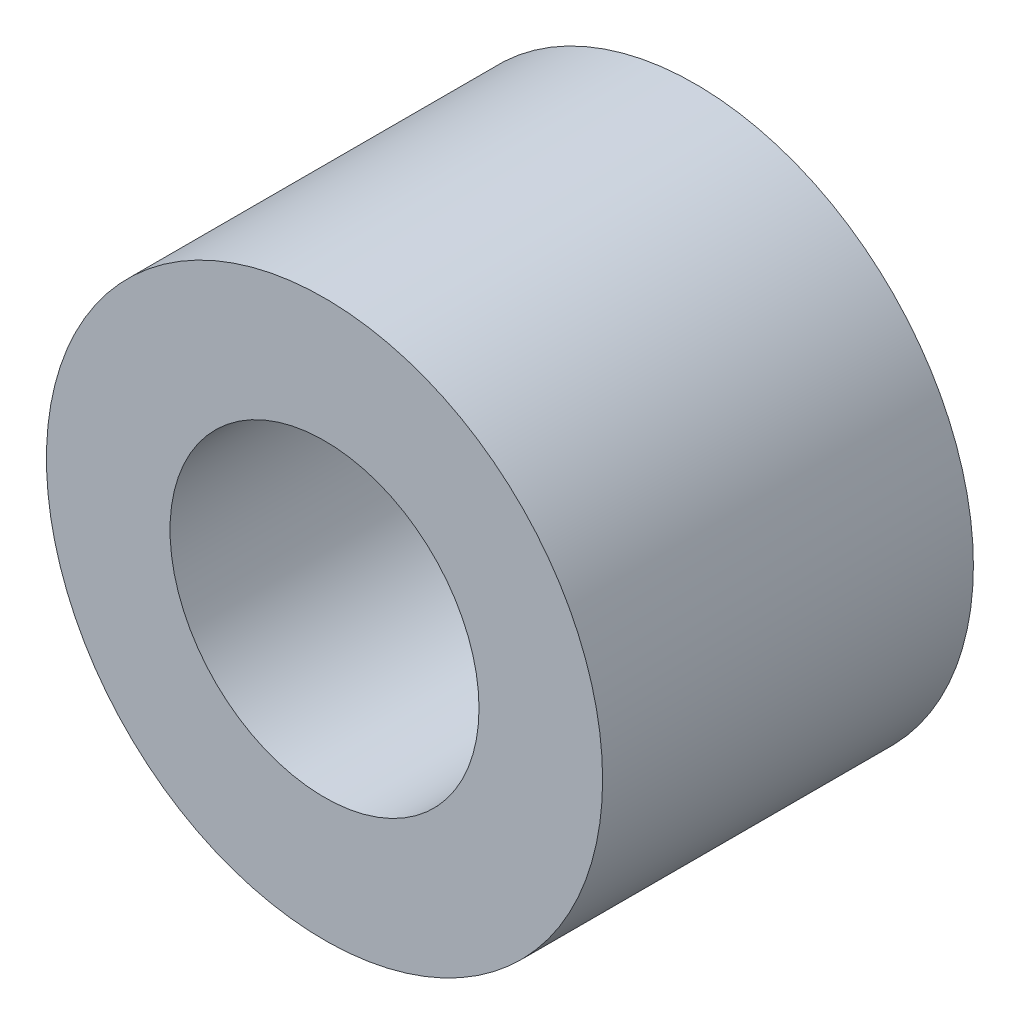
ISO-10303-21;
HEADER;
FILE_DESCRIPTION(('STEP AP214'),'2;1');
FILE_NAME('part.step','',(''),(''),'','','');
FILE_SCHEMA(('AUTOMOTIVE_DESIGN { 1 0 10303 214 1 1 1 1 }'));
ENDSEC;
DATA;
#1=APPLICATION_CONTEXT('core data for automotive mechanical design processes');
#2=APPLICATION_PROTOCOL_DEFINITION('international standard','automotive_design',2000,#1);
#3=PRODUCT_CONTEXT('',#1,'mechanical');
#4=PRODUCT('Part','Part','',(#3));
#5=PRODUCT_RELATED_PRODUCT_CATEGORY('part','',(#4));
#6=PRODUCT_DEFINITION_FORMATION('','',#4);
#7=PRODUCT_DEFINITION_CONTEXT('part definition',#1,'design');
#8=PRODUCT_DEFINITION('design','',#6,#7);
#9=PRODUCT_DEFINITION_SHAPE('','',#8);
#10=(LENGTH_UNIT() NAMED_UNIT(*) SI_UNIT(.MILLI.,.METRE.));
#11=(NAMED_UNIT(*) PLANE_ANGLE_UNIT() SI_UNIT($,.RADIAN.));
#12=(NAMED_UNIT(*) SI_UNIT($,.STERADIAN.) SOLID_ANGLE_UNIT());
#13=UNCERTAINTY_MEASURE_WITH_UNIT(LENGTH_MEASURE(1.E-05),#10,'distance_accuracy_value','');
#14=(GEOMETRIC_REPRESENTATION_CONTEXT(3) GLOBAL_UNCERTAINTY_ASSIGNED_CONTEXT((#13)) GLOBAL_UNIT_ASSIGNED_CONTEXT((#10,
#11,#12)) REPRESENTATION_CONTEXT('',''));
#15=CARTESIAN_POINT('',(0.,0.,0.));
#16=DIRECTION('',(0.,0.,1.));
#17=DIRECTION('',(1.,0.,0.));
#18=AXIS2_PLACEMENT_3D('',#15,#16,#17);
#19=CARTESIAN_POINT('',(0.,0.,6.));
#20=DIRECTION('',(0.,0.,1.));
#21=DIRECTION('',(1.,0.,0.));
#22=AXIS2_PLACEMENT_3D('',#19,#20,#21);
#23=PLANE('',#22);
#24=CARTESIAN_POINT('',(0.,0.,6.));
#25=DIRECTION('',(0.,0.,1.));
#26=DIRECTION('',(1.,0.,0.));
#27=AXIS2_PLACEMENT_3D('',#24,#25,#26);
#28=CIRCLE('',#27,4.5);
#29=CARTESIAN_POINT('',(4.5,0.,6.));
#30=VERTEX_POINT('',#29);
#31=EDGE_CURVE('E10',#30,#30,#28,.T.);
#32=ORIENTED_EDGE('',*,*,#31,.T.);
#33=EDGE_LOOP('',(#32));
#34=FACE_BOUND('',#33,.T.);
#35=CARTESIAN_POINT('',(0.,0.,6.));
#36=DIRECTION('',(0.,0.,1.));
#37=DIRECTION('',(1.,0.,0.));
#38=AXIS2_PLACEMENT_3D('',#35,#36,#37);
#39=CIRCLE('',#38,2.5);
#40=CARTESIAN_POINT('',(2.5,0.,6.));
#41=VERTEX_POINT('',#40);
#42=EDGE_CURVE('E42',#41,#41,#39,.T.);
#43=ORIENTED_EDGE('',*,*,#42,.F.);
#44=EDGE_LOOP('',(#43));
#45=FACE_BOUND('',#44,.T.);
#46=ADVANCED_FACE('F31',(#34,#45),#23,.T.);
#47=CARTESIAN_POINT('',(0.,0.,0.));
#48=DIRECTION('',(0.,0.,1.));
#49=DIRECTION('',(1.,0.,0.));
#50=AXIS2_PLACEMENT_3D('',#47,#48,#49);
#51=PLANE('',#50);
#52=CARTESIAN_POINT('',(0.,0.,0.));
#53=DIRECTION('',(0.,0.,1.));
#54=DIRECTION('',(1.,0.,0.));
#55=AXIS2_PLACEMENT_3D('',#52,#53,#54);
#56=CIRCLE('',#55,4.5);
#57=CARTESIAN_POINT('',(4.5,0.,0.));
#58=VERTEX_POINT('',#57);
#59=EDGE_CURVE('E35',#58,#58,#56,.T.);
#60=ORIENTED_EDGE('',*,*,#59,.F.);
#61=EDGE_LOOP('',(#60));
#62=FACE_BOUND('',#61,.T.);
#63=CARTESIAN_POINT('',(0.,0.,0.));
#64=DIRECTION('',(0.,0.,1.));
#65=DIRECTION('',(1.,0.,0.));
#66=AXIS2_PLACEMENT_3D('',#63,#64,#65);
#67=CIRCLE('',#66,2.5);
#68=CARTESIAN_POINT('',(2.5,0.,0.));
#69=VERTEX_POINT('',#68);
#70=EDGE_CURVE('E44',#69,#69,#67,.T.);
#71=ORIENTED_EDGE('',*,*,#70,.T.);
#72=EDGE_LOOP('',(#71));
#73=FACE_BOUND('',#72,.T.);
#74=ADVANCED_FACE('F54',(#62,#73),#51,.F.);
#75=CARTESIAN_POINT('',(0.,0.,6.));
#76=DIRECTION('',(0.,0.,-1.));
#77=DIRECTION('',(-1.,0.,0.));
#78=AXIS2_PLACEMENT_3D('',#75,#76,#77);
#79=CYLINDRICAL_SURFACE('',#78,4.5);
#80=ORIENTED_EDGE('',*,*,#31,.F.);
#81=EDGE_LOOP('',(#80));
#82=FACE_BOUND('',#81,.T.);
#83=ORIENTED_EDGE('',*,*,#59,.T.);
#84=EDGE_LOOP('',(#83));
#85=FACE_BOUND('',#84,.T.);
#86=ADVANCED_FACE('F33',(#82,#85),#79,.T.);
#87=CARTESIAN_POINT('',(0.,0.,6.));
#88=DIRECTION('',(0.,0.,-1.));
#89=DIRECTION('',(-1.,0.,0.));
#90=AXIS2_PLACEMENT_3D('',#87,#88,#89);
#91=CYLINDRICAL_SURFACE('',#90,2.5);
#92=ORIENTED_EDGE('',*,*,#42,.T.);
#93=EDGE_LOOP('',(#92));
#94=FACE_BOUND('',#93,.T.);
#95=ORIENTED_EDGE('',*,*,#70,.F.);
#96=EDGE_LOOP('',(#95));
#97=FACE_BOUND('',#96,.T.);
#98=ADVANCED_FACE('F50',(#94,#97),#91,.F.);
#99=CLOSED_SHELL('',(#46,#74,#86,#98));
#100=MANIFOLD_SOLID_BREP('B2',#99);
#101=ADVANCED_BREP_SHAPE_REPRESENTATION('',(#18,#100),#14);
#102=SHAPE_DEFINITION_REPRESENTATION(#9,#101);
ENDSEC;
END-ISO-10303-21;
